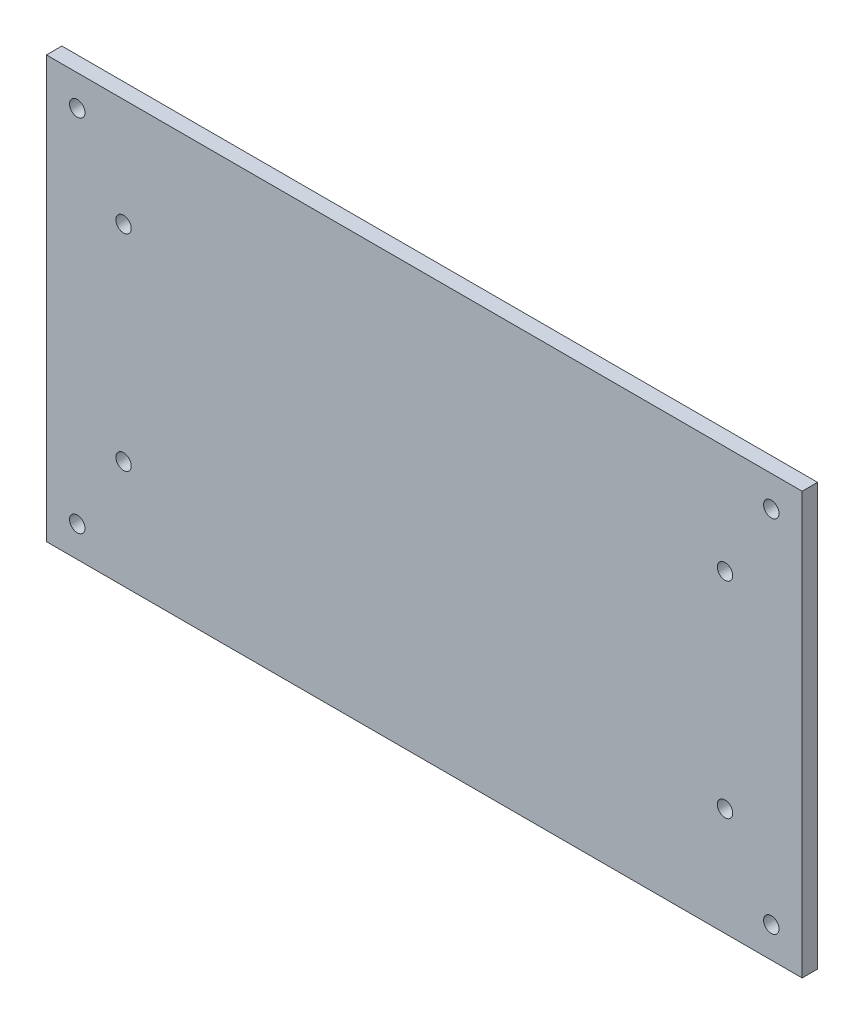
ISO-10303-21;
HEADER;
FILE_DESCRIPTION(('STEP AP214'),'2;1');
FILE_NAME('part.step','',(''),(''),'','','');
FILE_SCHEMA(('AUTOMOTIVE_DESIGN { 1 0 10303 214 1 1 1 1 }'));
ENDSEC;
DATA;
#1=APPLICATION_CONTEXT('core data for automotive mechanical design processes');
#2=APPLICATION_PROTOCOL_DEFINITION('international standard','automotive_design',2000,#1);
#3=PRODUCT_CONTEXT('',#1,'mechanical');
#4=PRODUCT('Part','Part','',(#3));
#5=PRODUCT_RELATED_PRODUCT_CATEGORY('part','',(#4));
#6=PRODUCT_DEFINITION_FORMATION('','',#4);
#7=PRODUCT_DEFINITION_CONTEXT('part definition',#1,'design');
#8=PRODUCT_DEFINITION('design','',#6,#7);
#9=PRODUCT_DEFINITION_SHAPE('','',#8);
#10=(LENGTH_UNIT() NAMED_UNIT(*) SI_UNIT(.MILLI.,.METRE.));
#11=(NAMED_UNIT(*) PLANE_ANGLE_UNIT() SI_UNIT($,.RADIAN.));
#12=(NAMED_UNIT(*) SI_UNIT($,.STERADIAN.) SOLID_ANGLE_UNIT());
#13=UNCERTAINTY_MEASURE_WITH_UNIT(LENGTH_MEASURE(1.E-05),#10,'distance_accuracy_value','');
#14=(GEOMETRIC_REPRESENTATION_CONTEXT(3) GLOBAL_UNCERTAINTY_ASSIGNED_CONTEXT((#13)) GLOBAL_UNIT_ASSIGNED_CONTEXT((#10,
#11,#12)) REPRESENTATION_CONTEXT('',''));
#15=CARTESIAN_POINT('',(0.,0.,0.));
#16=DIRECTION('',(0.,0.,1.));
#17=DIRECTION('',(1.,0.,0.));
#18=AXIS2_PLACEMENT_3D('',#15,#16,#17);
#19=CARTESIAN_POINT('',(0.,0.,3.));
#20=DIRECTION('',(0.,0.,1.));
#21=DIRECTION('',(1.,0.,0.));
#22=AXIS2_PLACEMENT_3D('',#19,#20,#21);
#23=PLANE('',#22);
#24=CARTESIAN_POINT('',(-61.9745454545454,14.5472727272727,3.));
#25=DIRECTION('',(0.,0.,-1.));
#26=DIRECTION('',(-1.,0.,0.));
#27=AXIS2_PLACEMENT_3D('',#24,#25,#26);
#28=CIRCLE('',#27,1.5);
#29=CARTESIAN_POINT('',(-63.4745454545454,14.5472727272727,3.));
#30=VERTEX_POINT('',#29);
#31=EDGE_CURVE('E146',#30,#30,#28,.T.);
#32=ORIENTED_EDGE('',*,*,#31,.T.);
#33=EDGE_LOOP('',(#32));
#34=FACE_BOUND('',#33,.T.);
#35=CARTESIAN_POINT('',(-61.9745454545454,-25.4527272727273,3.));
#36=DIRECTION('',(0.,0.,-1.));
#37=DIRECTION('',(-1.,0.,0.));
#38=AXIS2_PLACEMENT_3D('',#35,#36,#37);
#39=CIRCLE('',#38,1.5);
#40=CARTESIAN_POINT('',(-63.4745454545454,-25.4527272727273,3.));
#41=VERTEX_POINT('',#40);
#42=EDGE_CURVE('E152',#41,#41,#39,.T.);
#43=ORIENTED_EDGE('',*,*,#42,.T.);
#44=EDGE_LOOP('',(#43));
#45=FACE_BOUND('',#44,.T.);
#46=CARTESIAN_POINT('',(55.0254545454545,-25.4527272727273,3.));
#47=DIRECTION('',(0.,0.,-1.));
#48=DIRECTION('',(-1.,0.,0.));
#49=AXIS2_PLACEMENT_3D('',#46,#47,#48);
#50=CIRCLE('',#49,1.5);
#51=CARTESIAN_POINT('',(53.5254545454545,-25.4527272727273,3.));
#52=VERTEX_POINT('',#51);
#53=EDGE_CURVE('E140',#52,#52,#50,.T.);
#54=ORIENTED_EDGE('',*,*,#53,.T.);
#55=EDGE_LOOP('',(#54));
#56=FACE_BOUND('',#55,.T.);
#57=CARTESIAN_POINT('',(55.0254545454546,14.5472727272727,3.));
#58=DIRECTION('',(0.,0.,-1.));
#59=DIRECTION('',(-1.,0.,0.));
#60=AXIS2_PLACEMENT_3D('',#57,#58,#59);
#61=CIRCLE('',#60,1.5);
#62=CARTESIAN_POINT('',(53.5254545454546,14.5472727272727,3.));
#63=VERTEX_POINT('',#62);
#64=EDGE_CURVE('E134',#63,#63,#61,.T.);
#65=ORIENTED_EDGE('',*,*,#64,.T.);
#66=EDGE_LOOP('',(#65));
#67=FACE_BOUND('',#66,.T.);
#68=CARTESIAN_POINT('',(64.0254545454546,-40.4527272727273,3.));
#69=DIRECTION('',(0.,0.,1.));
#70=DIRECTION('',(1.,0.,0.));
#71=AXIS2_PLACEMENT_3D('',#68,#69,#70);
#72=CIRCLE('',#71,1.5);
#73=CARTESIAN_POINT('',(65.5254545454546,-40.4527272727273,3.));
#74=VERTEX_POINT('',#73);
#75=EDGE_CURVE('E122',#74,#74,#72,.T.);
#76=ORIENTED_EDGE('',*,*,#75,.F.);
#77=EDGE_LOOP('',(#76));
#78=FACE_BOUND('',#77,.T.);
#79=CARTESIAN_POINT('',(-70.9745454545454,29.5472727272727,3.));
#80=DIRECTION('',(0.,0.,1.));
#81=DIRECTION('',(1.,0.,0.));
#82=AXIS2_PLACEMENT_3D('',#79,#80,#81);
#83=CIRCLE('',#82,1.5);
#84=CARTESIAN_POINT('',(-69.4745454545454,29.5472727272727,3.));
#85=VERTEX_POINT('',#84);
#86=EDGE_CURVE('E101',#85,#85,#83,.T.);
#87=ORIENTED_EDGE('',*,*,#86,.F.);
#88=EDGE_LOOP('',(#87));
#89=FACE_BOUND('',#88,.T.);
#90=DIRECTION('',(0.,-1.,0.));
#91=VECTOR('',#90,1.);
#92=CARTESIAN_POINT('',(-76.9745454545454,35.5472727272727,3.));
#93=LINE('',#92,#91);
#94=CARTESIAN_POINT('',(-76.9745454545454,35.5472727272727,3.));
#95=VERTEX_POINT('',#94);
#96=CARTESIAN_POINT('',(-76.9745454545454,-46.4527272727273,3.));
#97=VERTEX_POINT('',#96);
#98=EDGE_CURVE('E86',#95,#97,#93,.T.);
#99=ORIENTED_EDGE('',*,*,#98,.T.);
#100=DIRECTION('',(1.,0.,0.));
#101=VECTOR('',#100,1.);
#102=CARTESIAN_POINT('',(-76.9745454545454,-46.4527272727273,3.));
#103=LINE('',#102,#101);
#104=CARTESIAN_POINT('',(70.0254545454546,-46.4527272727273,3.));
#105=VERTEX_POINT('',#104);
#106=EDGE_CURVE('E81',#97,#105,#103,.T.);
#107=ORIENTED_EDGE('',*,*,#106,.T.);
#108=DIRECTION('',(0.,1.,0.));
#109=VECTOR('',#108,1.);
#110=CARTESIAN_POINT('',(70.0254545454546,35.5472727272727,3.));
#111=LINE('',#110,#109);
#112=CARTESIAN_POINT('',(70.0254545454546,35.5472727272727,3.));
#113=VERTEX_POINT('',#112);
#114=EDGE_CURVE('E84',#105,#113,#111,.T.);
#115=ORIENTED_EDGE('',*,*,#114,.T.);
#116=DIRECTION('',(-1.,0.,0.));
#117=VECTOR('',#116,1.);
#118=CARTESIAN_POINT('',(-76.9745454545454,35.5472727272727,3.));
#119=LINE('',#118,#117);
#120=EDGE_CURVE('E51',#113,#95,#119,.T.);
#121=ORIENTED_EDGE('',*,*,#120,.T.);
#122=EDGE_LOOP('',(#99,#107,#115,#121));
#123=FACE_BOUND('',#122,.T.);
#124=CARTESIAN_POINT('',(64.0254545454546,29.5472727272727,3.));
#125=DIRECTION('',(0.,0.,1.));
#126=DIRECTION('',(-1.,0.,0.));
#127=AXIS2_PLACEMENT_3D('',#124,#125,#126);
#128=CIRCLE('',#127,1.5);
#129=CARTESIAN_POINT('',(62.5254545454546,29.5472727272727,3.));
#130=VERTEX_POINT('',#129);
#131=EDGE_CURVE('E116',#130,#130,#128,.T.);
#132=ORIENTED_EDGE('',*,*,#131,.F.);
#133=EDGE_LOOP('',(#132));
#134=FACE_BOUND('',#133,.T.);
#135=CARTESIAN_POINT('',(-70.9745454545454,-40.4527272727273,3.));
#136=DIRECTION('',(0.,0.,1.));
#137=DIRECTION('',(-1.,0.,0.));
#138=AXIS2_PLACEMENT_3D('',#135,#136,#137);
#139=CIRCLE('',#138,1.5);
#140=CARTESIAN_POINT('',(-72.4745454545454,-40.4527272727273,3.));
#141=VERTEX_POINT('',#140);
#142=EDGE_CURVE('E128',#141,#141,#139,.T.);
#143=ORIENTED_EDGE('',*,*,#142,.F.);
#144=EDGE_LOOP('',(#143));
#145=FACE_BOUND('',#144,.T.);
#146=ADVANCED_FACE('F34',(#34,#45,#56,#67,#78,#89,#123,#134,#145),#23,.T.);
#147=CARTESIAN_POINT('',(0.,0.,0.));
#148=DIRECTION('',(0.,0.,1.));
#149=DIRECTION('',(1.,0.,0.));
#150=AXIS2_PLACEMENT_3D('',#147,#148,#149);
#151=PLANE('',#150);
#152=CARTESIAN_POINT('',(-61.9745454545454,14.5472727272727,0.));
#153=DIRECTION('',(0.,0.,-1.));
#154=DIRECTION('',(-1.,0.,0.));
#155=AXIS2_PLACEMENT_3D('',#152,#153,#154);
#156=CIRCLE('',#155,1.5);
#157=CARTESIAN_POINT('',(-63.4745454545454,14.5472727272727,0.));
#158=VERTEX_POINT('',#157);
#159=EDGE_CURVE('E143',#158,#158,#156,.T.);
#160=ORIENTED_EDGE('',*,*,#159,.F.);
#161=EDGE_LOOP('',(#160));
#162=FACE_BOUND('',#161,.T.);
#163=CARTESIAN_POINT('',(-61.9745454545454,-25.4527272727273,0.));
#164=DIRECTION('',(0.,0.,-1.));
#165=DIRECTION('',(-1.,0.,0.));
#166=AXIS2_PLACEMENT_3D('',#163,#164,#165);
#167=CIRCLE('',#166,1.5);
#168=CARTESIAN_POINT('',(-63.4745454545454,-25.4527272727273,0.));
#169=VERTEX_POINT('',#168);
#170=EDGE_CURVE('E149',#169,#169,#167,.T.);
#171=ORIENTED_EDGE('',*,*,#170,.F.);
#172=EDGE_LOOP('',(#171));
#173=FACE_BOUND('',#172,.T.);
#174=CARTESIAN_POINT('',(55.0254545454545,-25.4527272727273,0.));
#175=DIRECTION('',(0.,0.,-1.));
#176=DIRECTION('',(-1.,0.,0.));
#177=AXIS2_PLACEMENT_3D('',#174,#175,#176);
#178=CIRCLE('',#177,1.5);
#179=CARTESIAN_POINT('',(53.5254545454545,-25.4527272727273,0.));
#180=VERTEX_POINT('',#179);
#181=EDGE_CURVE('E155',#180,#180,#178,.T.);
#182=ORIENTED_EDGE('',*,*,#181,.F.);
#183=EDGE_LOOP('',(#182));
#184=FACE_BOUND('',#183,.T.);
#185=CARTESIAN_POINT('',(55.0254545454546,14.5472727272727,0.));
#186=DIRECTION('',(0.,0.,-1.));
#187=DIRECTION('',(-1.,0.,0.));
#188=AXIS2_PLACEMENT_3D('',#185,#186,#187);
#189=CIRCLE('',#188,1.5);
#190=CARTESIAN_POINT('',(53.5254545454546,14.5472727272727,0.));
#191=VERTEX_POINT('',#190);
#192=EDGE_CURVE('E137',#191,#191,#189,.T.);
#193=ORIENTED_EDGE('',*,*,#192,.F.);
#194=EDGE_LOOP('',(#193));
#195=FACE_BOUND('',#194,.T.);
#196=DIRECTION('',(0.,-1.,0.));
#197=VECTOR('',#196,1.);
#198=CARTESIAN_POINT('',(-76.9745454545454,35.5472727272727,0.));
#199=LINE('',#198,#197);
#200=CARTESIAN_POINT('',(-76.9745454545454,35.5472727272727,0.));
#201=VERTEX_POINT('',#200);
#202=CARTESIAN_POINT('',(-76.9745454545454,-46.4527272727273,0.));
#203=VERTEX_POINT('',#202);
#204=EDGE_CURVE('E98',#201,#203,#199,.T.);
#205=ORIENTED_EDGE('',*,*,#204,.F.);
#206=DIRECTION('',(-1.,0.,0.));
#207=VECTOR('',#206,1.);
#208=CARTESIAN_POINT('',(-76.9745454545454,35.5472727272727,0.));
#209=LINE('',#208,#207);
#210=CARTESIAN_POINT('',(70.0254545454546,35.5472727272727,0.));
#211=VERTEX_POINT('',#210);
#212=EDGE_CURVE('E74',#211,#201,#209,.T.);
#213=ORIENTED_EDGE('',*,*,#212,.F.);
#214=DIRECTION('',(0.,1.,0.));
#215=VECTOR('',#214,1.);
#216=CARTESIAN_POINT('',(70.0254545454546,35.5472727272727,0.));
#217=LINE('',#216,#215);
#218=CARTESIAN_POINT('',(70.0254545454546,-46.4527272727273,0.));
#219=VERTEX_POINT('',#218);
#220=EDGE_CURVE('E68',#219,#211,#217,.T.);
#221=ORIENTED_EDGE('',*,*,#220,.F.);
#222=DIRECTION('',(1.,0.,0.));
#223=VECTOR('',#222,1.);
#224=CARTESIAN_POINT('',(-76.9745454545454,-46.4527272727273,0.));
#225=LINE('',#224,#223);
#226=EDGE_CURVE('E90',#203,#219,#225,.T.);
#227=ORIENTED_EDGE('',*,*,#226,.F.);
#228=EDGE_LOOP('',(#205,#213,#221,#227));
#229=FACE_BOUND('',#228,.T.);
#230=CARTESIAN_POINT('',(-70.9745454545454,29.5472727272727,0.));
#231=DIRECTION('',(0.,0.,1.));
#232=DIRECTION('',(1.,0.,0.));
#233=AXIS2_PLACEMENT_3D('',#230,#231,#232);
#234=CIRCLE('',#233,1.5);
#235=CARTESIAN_POINT('',(-69.4745454545454,29.5472727272727,0.));
#236=VERTEX_POINT('',#235);
#237=EDGE_CURVE('E113',#236,#236,#234,.T.);
#238=ORIENTED_EDGE('',*,*,#237,.T.);
#239=EDGE_LOOP('',(#238));
#240=FACE_BOUND('',#239,.T.);
#241=CARTESIAN_POINT('',(64.0254545454546,29.5472727272727,0.));
#242=DIRECTION('',(0.,0.,1.));
#243=DIRECTION('',(-1.,0.,0.));
#244=AXIS2_PLACEMENT_3D('',#241,#242,#243);
#245=CIRCLE('',#244,1.5);
#246=CARTESIAN_POINT('',(62.5254545454546,29.5472727272727,0.));
#247=VERTEX_POINT('',#246);
#248=EDGE_CURVE('E119',#247,#247,#245,.T.);
#249=ORIENTED_EDGE('',*,*,#248,.T.);
#250=EDGE_LOOP('',(#249));
#251=FACE_BOUND('',#250,.T.);
#252=CARTESIAN_POINT('',(64.0254545454546,-40.4527272727273,0.));
#253=DIRECTION('',(0.,0.,1.));
#254=DIRECTION('',(1.,0.,0.));
#255=AXIS2_PLACEMENT_3D('',#252,#253,#254);
#256=CIRCLE('',#255,1.5);
#257=CARTESIAN_POINT('',(65.5254545454546,-40.4527272727273,0.));
#258=VERTEX_POINT('',#257);
#259=EDGE_CURVE('E125',#258,#258,#256,.T.);
#260=ORIENTED_EDGE('',*,*,#259,.T.);
#261=EDGE_LOOP('',(#260));
#262=FACE_BOUND('',#261,.T.);
#263=CARTESIAN_POINT('',(-70.9745454545454,-40.4527272727273,0.));
#264=DIRECTION('',(0.,0.,1.));
#265=DIRECTION('',(-1.,0.,0.));
#266=AXIS2_PLACEMENT_3D('',#263,#264,#265);
#267=CIRCLE('',#266,1.5);
#268=CARTESIAN_POINT('',(-72.4745454545454,-40.4527272727273,0.));
#269=VERTEX_POINT('',#268);
#270=EDGE_CURVE('E131',#269,#269,#267,.T.);
#271=ORIENTED_EDGE('',*,*,#270,.T.);
#272=EDGE_LOOP('',(#271));
#273=FACE_BOUND('',#272,.T.);
#274=ADVANCED_FACE('F109',(#162,#173,#184,#195,#229,#240,#251,#262,#273),#151,.F.);
#275=CARTESIAN_POINT('',(-76.9745454545454,35.5472727272727,3.));
#276=DIRECTION('',(1.,0.,0.));
#277=DIRECTION('',(0.,0.,-1.));
#278=AXIS2_PLACEMENT_3D('',#275,#276,#277);
#279=PLANE('',#278);
#280=ORIENTED_EDGE('',*,*,#204,.T.);
#281=DIRECTION('',(0.,0.,-1.));
#282=VECTOR('',#281,1.);
#283=CARTESIAN_POINT('',(-76.9745454545454,-46.4527272727273,3.));
#284=LINE('',#283,#282);
#285=EDGE_CURVE('E11',#97,#203,#284,.T.);
#286=ORIENTED_EDGE('',*,*,#285,.F.);
#287=ORIENTED_EDGE('',*,*,#98,.F.);
#288=DIRECTION('',(0.,0.,-1.));
#289=VECTOR('',#288,1.);
#290=CARTESIAN_POINT('',(-76.9745454545454,35.5472727272727,3.));
#291=LINE('',#290,#289);
#292=EDGE_CURVE('E94',#95,#201,#291,.T.);
#293=ORIENTED_EDGE('',*,*,#292,.T.);
#294=EDGE_LOOP('',(#280,#286,#287,#293));
#295=FACE_BOUND('',#294,.T.);
#296=ADVANCED_FACE('F36',(#295),#279,.F.);
#297=CARTESIAN_POINT('',(-76.9745454545454,-46.4527272727273,3.));
#298=DIRECTION('',(0.,1.,0.));
#299=DIRECTION('',(0.,0.,1.));
#300=AXIS2_PLACEMENT_3D('',#297,#298,#299);
#301=PLANE('',#300);
#302=ORIENTED_EDGE('',*,*,#226,.T.);
#303=DIRECTION('',(0.,0.,-1.));
#304=VECTOR('',#303,1.);
#305=CARTESIAN_POINT('',(70.0254545454546,-46.4527272727273,3.));
#306=LINE('',#305,#304);
#307=EDGE_CURVE('E43',#105,#219,#306,.T.);
#308=ORIENTED_EDGE('',*,*,#307,.F.);
#309=ORIENTED_EDGE('',*,*,#106,.F.);
#310=ORIENTED_EDGE('',*,*,#285,.T.);
#311=EDGE_LOOP('',(#302,#308,#309,#310));
#312=FACE_BOUND('',#311,.T.);
#313=ADVANCED_FACE('F89',(#312),#301,.F.);
#314=CARTESIAN_POINT('',(70.0254545454546,35.5472727272727,3.));
#315=DIRECTION('',(-1.,0.,0.));
#316=DIRECTION('',(0.,-1.,0.));
#317=AXIS2_PLACEMENT_3D('',#314,#315,#316);
#318=PLANE('',#317);
#319=ORIENTED_EDGE('',*,*,#220,.T.);
#320=DIRECTION('',(0.,0.,-1.));
#321=VECTOR('',#320,1.);
#322=CARTESIAN_POINT('',(70.0254545454546,35.5472727272727,3.));
#323=LINE('',#322,#321);
#324=EDGE_CURVE('E91',#113,#211,#323,.T.);
#325=ORIENTED_EDGE('',*,*,#324,.F.);
#326=ORIENTED_EDGE('',*,*,#114,.F.);
#327=ORIENTED_EDGE('',*,*,#307,.T.);
#328=EDGE_LOOP('',(#319,#325,#326,#327));
#329=FACE_BOUND('',#328,.T.);
#330=ADVANCED_FACE('F92',(#329),#318,.F.);
#331=CARTESIAN_POINT('',(-76.9745454545454,35.5472727272727,3.));
#332=DIRECTION('',(0.,-1.,0.));
#333=DIRECTION('',(0.,0.,-1.));
#334=AXIS2_PLACEMENT_3D('',#331,#332,#333);
#335=PLANE('',#334);
#336=ORIENTED_EDGE('',*,*,#212,.T.);
#337=ORIENTED_EDGE('',*,*,#292,.F.);
#338=ORIENTED_EDGE('',*,*,#120,.F.);
#339=ORIENTED_EDGE('',*,*,#324,.T.);
#340=EDGE_LOOP('',(#336,#337,#338,#339));
#341=FACE_BOUND('',#340,.T.);
#342=ADVANCED_FACE('F106',(#341),#335,.F.);
#343=CARTESIAN_POINT('',(-70.9745454545454,29.5472727272727,3.));
#344=DIRECTION('',(0.,0.,-1.));
#345=DIRECTION('',(-1.,0.,0.));
#346=AXIS2_PLACEMENT_3D('',#343,#344,#345);
#347=CYLINDRICAL_SURFACE('',#346,1.5);
#348=ORIENTED_EDGE('',*,*,#86,.T.);
#349=EDGE_LOOP('',(#348));
#350=FACE_BOUND('',#349,.T.);
#351=ORIENTED_EDGE('',*,*,#237,.F.);
#352=EDGE_LOOP('',(#351));
#353=FACE_BOUND('',#352,.T.);
#354=ADVANCED_FACE('F196',(#350,#353),#347,.F.);
#355=CARTESIAN_POINT('',(64.0254545454546,29.5472727272727,3.));
#356=DIRECTION('',(0.,0.,-1.));
#357=DIRECTION('',(-1.,0.,0.));
#358=AXIS2_PLACEMENT_3D('',#355,#356,#357);
#359=CYLINDRICAL_SURFACE('',#358,1.5);
#360=ORIENTED_EDGE('',*,*,#131,.T.);
#361=EDGE_LOOP('',(#360));
#362=FACE_BOUND('',#361,.T.);
#363=ORIENTED_EDGE('',*,*,#248,.F.);
#364=EDGE_LOOP('',(#363));
#365=FACE_BOUND('',#364,.T.);
#366=ADVANCED_FACE('F264',(#362,#365),#359,.F.);
#367=CARTESIAN_POINT('',(64.0254545454546,-40.4527272727273,3.));
#368=DIRECTION('',(0.,0.,-1.));
#369=DIRECTION('',(-1.,0.,0.));
#370=AXIS2_PLACEMENT_3D('',#367,#368,#369);
#371=CYLINDRICAL_SURFACE('',#370,1.5);
#372=ORIENTED_EDGE('',*,*,#75,.T.);
#373=EDGE_LOOP('',(#372));
#374=FACE_BOUND('',#373,.T.);
#375=ORIENTED_EDGE('',*,*,#259,.F.);
#376=EDGE_LOOP('',(#375));
#377=FACE_BOUND('',#376,.T.);
#378=ADVANCED_FACE('F184',(#374,#377),#371,.F.);
#379=CARTESIAN_POINT('',(-70.9745454545454,-40.4527272727273,3.));
#380=DIRECTION('',(0.,0.,-1.));
#381=DIRECTION('',(-1.,0.,0.));
#382=AXIS2_PLACEMENT_3D('',#379,#380,#381);
#383=CYLINDRICAL_SURFACE('',#382,1.5);
#384=ORIENTED_EDGE('',*,*,#142,.T.);
#385=EDGE_LOOP('',(#384));
#386=FACE_BOUND('',#385,.T.);
#387=ORIENTED_EDGE('',*,*,#270,.F.);
#388=EDGE_LOOP('',(#387));
#389=FACE_BOUND('',#388,.T.);
#390=ADVANCED_FACE('F178',(#386,#389),#383,.F.);
#391=CARTESIAN_POINT('',(55.0254545454546,14.5472727272727,3.));
#392=DIRECTION('',(0.,0.,-1.));
#393=DIRECTION('',(-1.,0.,0.));
#394=AXIS2_PLACEMENT_3D('',#391,#392,#393);
#395=CYLINDRICAL_SURFACE('',#394,1.5);
#396=ORIENTED_EDGE('',*,*,#64,.F.);
#397=EDGE_LOOP('',(#396));
#398=FACE_BOUND('',#397,.T.);
#399=ORIENTED_EDGE('',*,*,#192,.T.);
#400=EDGE_LOOP('',(#399));
#401=FACE_BOUND('',#400,.T.);
#402=ADVANCED_FACE('F167',(#398,#401),#395,.F.);
#403=CARTESIAN_POINT('',(55.0254545454545,-25.4527272727273,3.));
#404=DIRECTION('',(0.,0.,-1.));
#405=DIRECTION('',(-1.,0.,0.));
#406=AXIS2_PLACEMENT_3D('',#403,#404,#405);
#407=CYLINDRICAL_SURFACE('',#406,1.5);
#408=ORIENTED_EDGE('',*,*,#53,.F.);
#409=EDGE_LOOP('',(#408));
#410=FACE_BOUND('',#409,.T.);
#411=ORIENTED_EDGE('',*,*,#181,.T.);
#412=EDGE_LOOP('',(#411));
#413=FACE_BOUND('',#412,.T.);
#414=ADVANCED_FACE('F163',(#410,#413),#407,.F.);
#415=CARTESIAN_POINT('',(-61.9745454545454,-25.4527272727273,3.));
#416=DIRECTION('',(0.,0.,-1.));
#417=DIRECTION('',(-1.,0.,0.));
#418=AXIS2_PLACEMENT_3D('',#415,#416,#417);
#419=CYLINDRICAL_SURFACE('',#418,1.5);
#420=ORIENTED_EDGE('',*,*,#42,.F.);
#421=EDGE_LOOP('',(#420));
#422=FACE_BOUND('',#421,.T.);
#423=ORIENTED_EDGE('',*,*,#170,.T.);
#424=EDGE_LOOP('',(#423));
#425=FACE_BOUND('',#424,.T.);
#426=ADVANCED_FACE('F166',(#422,#425),#419,.F.);
#427=CARTESIAN_POINT('',(-61.9745454545454,14.5472727272727,3.));
#428=DIRECTION('',(0.,0.,-1.));
#429=DIRECTION('',(-1.,0.,0.));
#430=AXIS2_PLACEMENT_3D('',#427,#428,#429);
#431=CYLINDRICAL_SURFACE('',#430,1.5);
#432=ORIENTED_EDGE('',*,*,#31,.F.);
#433=EDGE_LOOP('',(#432));
#434=FACE_BOUND('',#433,.T.);
#435=ORIENTED_EDGE('',*,*,#159,.T.);
#436=EDGE_LOOP('',(#435));
#437=FACE_BOUND('',#436,.T.);
#438=ADVANCED_FACE('F235',(#434,#437),#431,.F.);
#439=CLOSED_SHELL('',(#146,#274,#296,#313,#330,#342,#354,#366,#378,#390,#402,#414,#426,#438));
#440=MANIFOLD_SOLID_BREP('B2',#439);
#441=ADVANCED_BREP_SHAPE_REPRESENTATION('',(#18,#440),#14);
#442=SHAPE_DEFINITION_REPRESENTATION(#9,#441);
ENDSEC;
END-ISO-10303-21;
